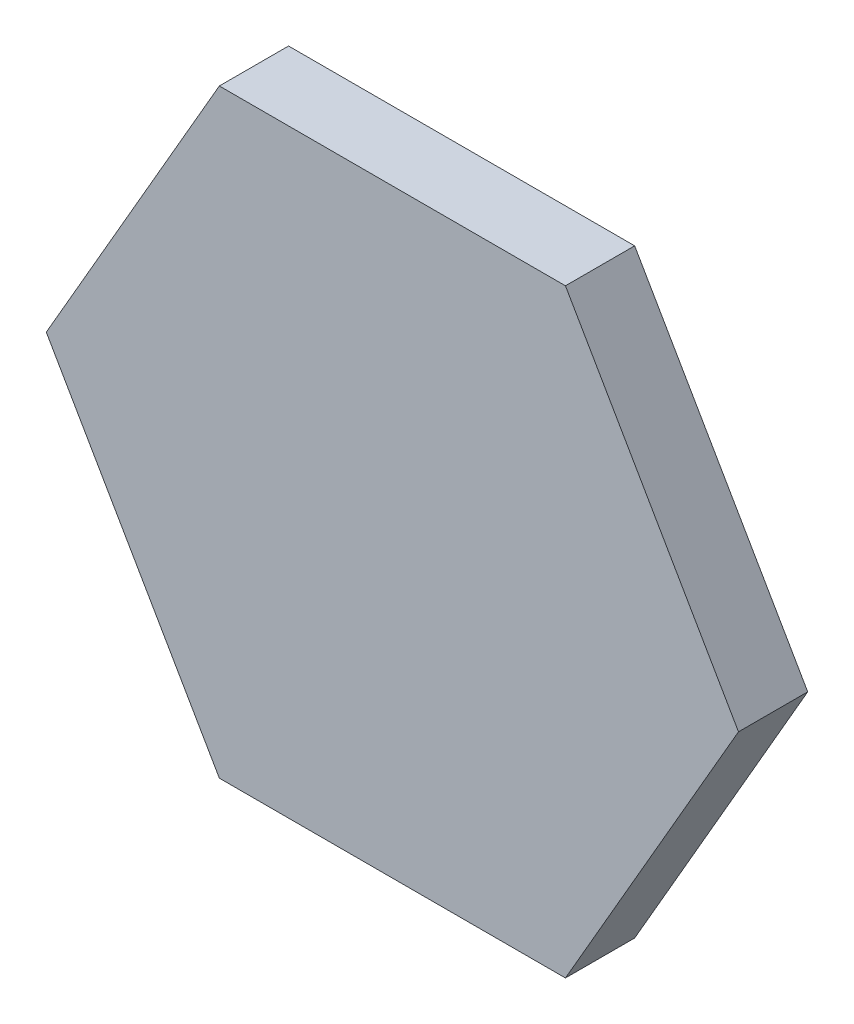
ISO-10303-21;
HEADER;
FILE_DESCRIPTION(('STEP AP214'),'2;1');
FILE_NAME('part.step','',(''),(''),'','','');
FILE_SCHEMA(('AUTOMOTIVE_DESIGN { 1 0 10303 214 1 1 1 1 }'));
ENDSEC;
DATA;
#1=APPLICATION_CONTEXT('core data for automotive mechanical design processes');
#2=APPLICATION_PROTOCOL_DEFINITION('international standard','automotive_design',2000,#1);
#3=PRODUCT_CONTEXT('',#1,'mechanical');
#4=PRODUCT('Part','Part','',(#3));
#5=PRODUCT_RELATED_PRODUCT_CATEGORY('part','',(#4));
#6=PRODUCT_DEFINITION_FORMATION('','',#4);
#7=PRODUCT_DEFINITION_CONTEXT('part definition',#1,'design');
#8=PRODUCT_DEFINITION('design','',#6,#7);
#9=PRODUCT_DEFINITION_SHAPE('','',#8);
#10=(LENGTH_UNIT() NAMED_UNIT(*) SI_UNIT(.MILLI.,.METRE.));
#11=(NAMED_UNIT(*) PLANE_ANGLE_UNIT() SI_UNIT($,.RADIAN.));
#12=(NAMED_UNIT(*) SI_UNIT($,.STERADIAN.) SOLID_ANGLE_UNIT());
#13=UNCERTAINTY_MEASURE_WITH_UNIT(LENGTH_MEASURE(1.E-05),#10,'distance_accuracy_value','');
#14=(GEOMETRIC_REPRESENTATION_CONTEXT(3) GLOBAL_UNCERTAINTY_ASSIGNED_CONTEXT((#13)) GLOBAL_UNIT_ASSIGNED_CONTEXT((#10,
#11,#12)) REPRESENTATION_CONTEXT('',''));
#15=CARTESIAN_POINT('',(0.,0.,0.));
#16=DIRECTION('',(0.,0.,1.));
#17=DIRECTION('',(1.,0.,0.));
#18=AXIS2_PLACEMENT_3D('',#15,#16,#17);
#19=CARTESIAN_POINT('',(-37.5,-64.9519052838329,15.));
#20=DIRECTION('',(0.,1.,0.));
#21=DIRECTION('',(0.,0.,1.));
#22=AXIS2_PLACEMENT_3D('',#19,#20,#21);
#23=PLANE('',#22);
#24=DIRECTION('',(1.,0.,0.));
#25=VECTOR('',#24,1.);
#26=CARTESIAN_POINT('',(-37.5,-64.9519052838329,0.));
#27=LINE('',#26,#25);
#28=CARTESIAN_POINT('',(-37.5,-64.9519052838329,0.));
#29=VERTEX_POINT('',#28);
#30=CARTESIAN_POINT('',(37.5,-64.9519052838329,0.));
#31=VERTEX_POINT('',#30);
#32=EDGE_CURVE('E118',#29,#31,#27,.T.);
#33=ORIENTED_EDGE('',*,*,#32,.T.);
#34=DIRECTION('',(0.,0.,-1.));
#35=VECTOR('',#34,1.);
#36=CARTESIAN_POINT('',(37.5,-64.9519052838329,15.));
#37=LINE('',#36,#35);
#38=CARTESIAN_POINT('',(37.5,-64.9519052838329,15.));
#39=VERTEX_POINT('',#38);
#40=EDGE_CURVE('E11',#39,#31,#37,.T.);
#41=ORIENTED_EDGE('',*,*,#40,.F.);
#42=DIRECTION('',(1.,0.,0.));
#43=VECTOR('',#42,1.);
#44=CARTESIAN_POINT('',(-37.5,-64.9519052838329,15.));
#45=LINE('',#44,#43);
#46=CARTESIAN_POINT('',(-37.5,-64.9519052838329,15.));
#47=VERTEX_POINT('',#46);
#48=EDGE_CURVE('E128',#47,#39,#45,.T.);
#49=ORIENTED_EDGE('',*,*,#48,.F.);
#50=DIRECTION('',(0.,0.,-1.));
#51=VECTOR('',#50,1.);
#52=CARTESIAN_POINT('',(-37.5,-64.9519052838329,15.));
#53=LINE('',#52,#51);
#54=EDGE_CURVE('E114',#47,#29,#53,.T.);
#55=ORIENTED_EDGE('',*,*,#54,.T.);
#56=EDGE_LOOP('',(#33,#41,#49,#55));
#57=FACE_BOUND('',#56,.T.);
#58=ADVANCED_FACE('F34',(#57),#23,.F.);
#59=CARTESIAN_POINT('',(37.5,-64.9519052838329,15.));
#60=DIRECTION('',(-0.866025403784439,0.5,0.));
#61=DIRECTION('',(-0.5,-0.866025403784439,0.));
#62=AXIS2_PLACEMENT_3D('',#59,#60,#61);
#63=PLANE('',#62);
#64=DIRECTION('',(0.5,0.866025403784439,0.));
#65=VECTOR('',#64,1.);
#66=CARTESIAN_POINT('',(37.5,-64.9519052838329,0.));
#67=LINE('',#66,#65);
#68=CARTESIAN_POINT('',(75.,0.,0.));
#69=VERTEX_POINT('',#68);
#70=EDGE_CURVE('E121',#31,#69,#67,.T.);
#71=ORIENTED_EDGE('',*,*,#70,.T.);
#72=DIRECTION('',(0.,0.,-1.));
#73=VECTOR('',#72,1.);
#74=CARTESIAN_POINT('',(75.,0.,15.));
#75=LINE('',#74,#73);
#76=CARTESIAN_POINT('',(75.,0.,15.));
#77=VERTEX_POINT('',#76);
#78=EDGE_CURVE('E42',#77,#69,#75,.T.);
#79=ORIENTED_EDGE('',*,*,#78,.F.);
#80=DIRECTION('',(0.5,0.866025403784439,0.));
#81=VECTOR('',#80,1.);
#82=CARTESIAN_POINT('',(37.5,-64.9519052838329,15.));
#83=LINE('',#82,#81);
#84=EDGE_CURVE('E87',#39,#77,#83,.T.);
#85=ORIENTED_EDGE('',*,*,#84,.F.);
#86=ORIENTED_EDGE('',*,*,#40,.T.);
#87=EDGE_LOOP('',(#71,#79,#85,#86));
#88=FACE_BOUND('',#87,.T.);
#89=ADVANCED_FACE('F152',(#88),#63,.F.);
#90=CARTESIAN_POINT('',(75.,0.,15.));
#91=DIRECTION('',(-0.866025403784439,-0.5,0.));
#92=DIRECTION('',(0.5,-0.866025403784439,0.));
#93=AXIS2_PLACEMENT_3D('',#90,#91,#92);
#94=PLANE('',#93);
#95=DIRECTION('',(-0.5,0.866025403784439,0.));
#96=VECTOR('',#95,1.);
#97=CARTESIAN_POINT('',(75.,0.,0.));
#98=LINE('',#97,#96);
#99=CARTESIAN_POINT('',(37.5,64.9519052838329,0.));
#100=VERTEX_POINT('',#99);
#101=EDGE_CURVE('E123',#69,#100,#98,.T.);
#102=ORIENTED_EDGE('',*,*,#101,.T.);
#103=DIRECTION('',(0.,0.,-1.));
#104=VECTOR('',#103,1.);
#105=CARTESIAN_POINT('',(37.5,64.9519052838329,15.));
#106=LINE('',#105,#104);
#107=CARTESIAN_POINT('',(37.5,64.9519052838329,15.));
#108=VERTEX_POINT('',#107);
#109=EDGE_CURVE('E109',#108,#100,#106,.T.);
#110=ORIENTED_EDGE('',*,*,#109,.F.);
#111=DIRECTION('',(-0.5,0.866025403784439,0.));
#112=VECTOR('',#111,1.);
#113=CARTESIAN_POINT('',(75.,0.,15.));
#114=LINE('',#113,#112);
#115=EDGE_CURVE('E100',#77,#108,#114,.T.);
#116=ORIENTED_EDGE('',*,*,#115,.F.);
#117=ORIENTED_EDGE('',*,*,#78,.T.);
#118=EDGE_LOOP('',(#102,#110,#116,#117));
#119=FACE_BOUND('',#118,.T.);
#120=ADVANCED_FACE('F134',(#119),#94,.F.);
#121=CARTESIAN_POINT('',(37.5,64.9519052838329,15.));
#122=DIRECTION('',(0.,-1.,0.));
#123=DIRECTION('',(1.,0.,0.));
#124=AXIS2_PLACEMENT_3D('',#121,#122,#123);
#125=PLANE('',#124);
#126=DIRECTION('',(-1.,0.,0.));
#127=VECTOR('',#126,1.);
#128=CARTESIAN_POINT('',(37.5,64.9519052838329,0.));
#129=LINE('',#128,#127);
#130=CARTESIAN_POINT('',(-37.5,64.9519052838329,0.));
#131=VERTEX_POINT('',#130);
#132=EDGE_CURVE('E108',#100,#131,#129,.T.);
#133=ORIENTED_EDGE('',*,*,#132,.T.);
#134=DIRECTION('',(0.,0.,-1.));
#135=VECTOR('',#134,1.);
#136=CARTESIAN_POINT('',(-37.5,64.9519052838329,15.));
#137=LINE('',#136,#135);
#138=CARTESIAN_POINT('',(-37.5,64.9519052838329,15.));
#139=VERTEX_POINT('',#138);
#140=EDGE_CURVE('E105',#139,#131,#137,.T.);
#141=ORIENTED_EDGE('',*,*,#140,.F.);
#142=DIRECTION('',(-1.,0.,0.));
#143=VECTOR('',#142,1.);
#144=CARTESIAN_POINT('',(37.5,64.9519052838329,15.));
#145=LINE('',#144,#143);
#146=EDGE_CURVE('E94',#108,#139,#145,.T.);
#147=ORIENTED_EDGE('',*,*,#146,.F.);
#148=ORIENTED_EDGE('',*,*,#109,.T.);
#149=EDGE_LOOP('',(#133,#141,#147,#148));
#150=FACE_BOUND('',#149,.T.);
#151=ADVANCED_FACE('F106',(#150),#125,.F.);
#152=CARTESIAN_POINT('',(-37.5,64.9519052838329,15.));
#153=DIRECTION('',(0.866025403784438,-0.5,0.));
#154=DIRECTION('',(0.5,0.866025403784439,0.));
#155=AXIS2_PLACEMENT_3D('',#152,#153,#154);
#156=PLANE('',#155);
#157=DIRECTION('',(-0.5,-0.866025403784439,0.));
#158=VECTOR('',#157,1.);
#159=CARTESIAN_POINT('',(-37.5,64.9519052838329,0.));
#160=LINE('',#159,#158);
#161=CARTESIAN_POINT('',(-75.,0.,0.));
#162=VERTEX_POINT('',#161);
#163=EDGE_CURVE('E73',#131,#162,#160,.T.);
#164=ORIENTED_EDGE('',*,*,#163,.T.);
#165=DIRECTION('',(0.,0.,-1.));
#166=VECTOR('',#165,1.);
#167=CARTESIAN_POINT('',(-75.,0.,15.));
#168=LINE('',#167,#166);
#169=CARTESIAN_POINT('',(-75.,0.,15.));
#170=VERTEX_POINT('',#169);
#171=EDGE_CURVE('E110',#170,#162,#168,.T.);
#172=ORIENTED_EDGE('',*,*,#171,.F.);
#173=DIRECTION('',(-0.5,-0.866025403784439,0.));
#174=VECTOR('',#173,1.);
#175=CARTESIAN_POINT('',(-37.5,64.9519052838329,15.));
#176=LINE('',#175,#174);
#177=EDGE_CURVE('E98',#139,#170,#176,.T.);
#178=ORIENTED_EDGE('',*,*,#177,.F.);
#179=ORIENTED_EDGE('',*,*,#140,.T.);
#180=EDGE_LOOP('',(#164,#172,#178,#179));
#181=FACE_BOUND('',#180,.T.);
#182=ADVANCED_FACE('F112',(#181),#156,.F.);
#183=CARTESIAN_POINT('',(-75.,0.,15.));
#184=DIRECTION('',(0.866025403784439,0.5,0.));
#185=DIRECTION('',(-0.5,0.866025403784439,0.));
#186=AXIS2_PLACEMENT_3D('',#183,#184,#185);
#187=PLANE('',#186);
#188=DIRECTION('',(0.5,-0.866025403784439,0.));
#189=VECTOR('',#188,1.);
#190=CARTESIAN_POINT('',(-75.,0.,0.));
#191=LINE('',#190,#189);
#192=EDGE_CURVE('E79',#162,#29,#191,.T.);
#193=ORIENTED_EDGE('',*,*,#192,.T.);
#194=ORIENTED_EDGE('',*,*,#54,.F.);
#195=DIRECTION('',(0.5,-0.866025403784439,0.));
#196=VECTOR('',#195,1.);
#197=CARTESIAN_POINT('',(-75.,0.,15.));
#198=LINE('',#197,#196);
#199=EDGE_CURVE('E50',#170,#47,#198,.T.);
#200=ORIENTED_EDGE('',*,*,#199,.F.);
#201=ORIENTED_EDGE('',*,*,#171,.T.);
#202=EDGE_LOOP('',(#193,#194,#200,#201));
#203=FACE_BOUND('',#202,.T.);
#204=ADVANCED_FACE('F141',(#203),#187,.F.);
#205=CARTESIAN_POINT('',(0.,0.,15.));
#206=DIRECTION('',(0.,0.,1.));
#207=DIRECTION('',(1.,0.,0.));
#208=AXIS2_PLACEMENT_3D('',#205,#206,#207);
#209=PLANE('',#208);
#210=ORIENTED_EDGE('',*,*,#48,.T.);
#211=ORIENTED_EDGE('',*,*,#84,.T.);
#212=ORIENTED_EDGE('',*,*,#115,.T.);
#213=ORIENTED_EDGE('',*,*,#146,.T.);
#214=ORIENTED_EDGE('',*,*,#177,.T.);
#215=ORIENTED_EDGE('',*,*,#199,.T.);
#216=EDGE_LOOP('',(#210,#211,#212,#213,#214,#215));
#217=FACE_BOUND('',#216,.T.);
#218=ADVANCED_FACE('F96',(#217),#209,.T.);
#219=CARTESIAN_POINT('',(0.,0.,0.));
#220=DIRECTION('',(0.,0.,1.));
#221=DIRECTION('',(1.,0.,0.));
#222=AXIS2_PLACEMENT_3D('',#219,#220,#221);
#223=PLANE('',#222);
#224=ORIENTED_EDGE('',*,*,#32,.F.);
#225=ORIENTED_EDGE('',*,*,#192,.F.);
#226=ORIENTED_EDGE('',*,*,#163,.F.);
#227=ORIENTED_EDGE('',*,*,#132,.F.);
#228=ORIENTED_EDGE('',*,*,#101,.F.);
#229=ORIENTED_EDGE('',*,*,#70,.F.);
#230=EDGE_LOOP('',(#224,#225,#226,#227,#228,#229));
#231=FACE_BOUND('',#230,.T.);
#232=ADVANCED_FACE('F137',(#231),#223,.F.);
#233=CLOSED_SHELL('',(#58,#89,#120,#151,#182,#204,#218,#232));
#234=MANIFOLD_SOLID_BREP('B2',#233);
#235=ADVANCED_BREP_SHAPE_REPRESENTATION('',(#18,#234),#14);
#236=SHAPE_DEFINITION_REPRESENTATION(#9,#235);
ENDSEC;
END-ISO-10303-21;
